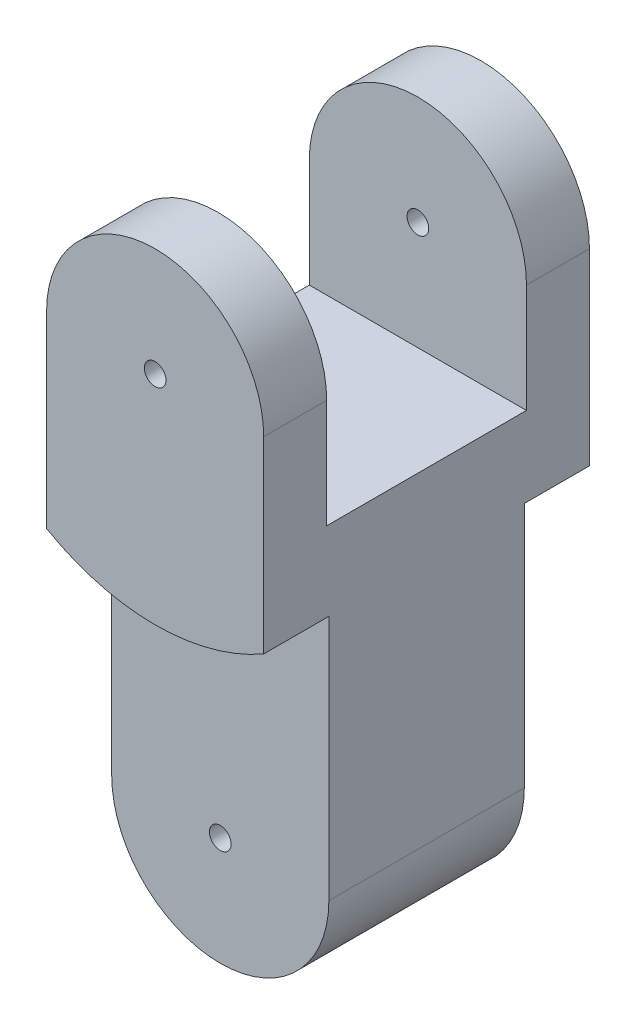
ISO-10303-21;
HEADER;
FILE_DESCRIPTION(('STEP AP214'),'2;1');
FILE_NAME('part.step','',(''),(''),'','','');
FILE_SCHEMA(('AUTOMOTIVE_DESIGN { 1 0 10303 214 1 1 1 1 }'));
ENDSEC;
DATA;
#1=APPLICATION_CONTEXT('core data for automotive mechanical design processes');
#2=APPLICATION_PROTOCOL_DEFINITION('international standard','automotive_design',2000,#1);
#3=PRODUCT_CONTEXT('',#1,'mechanical');
#4=PRODUCT('Part','Part','',(#3));
#5=PRODUCT_RELATED_PRODUCT_CATEGORY('part','',(#4));
#6=PRODUCT_DEFINITION_FORMATION('','',#4);
#7=PRODUCT_DEFINITION_CONTEXT('part definition',#1,'design');
#8=PRODUCT_DEFINITION('design','',#6,#7);
#9=PRODUCT_DEFINITION_SHAPE('','',#8);
#10=(LENGTH_UNIT() NAMED_UNIT(*) SI_UNIT(.MILLI.,.METRE.));
#11=(NAMED_UNIT(*) PLANE_ANGLE_UNIT() SI_UNIT($,.RADIAN.));
#12=(NAMED_UNIT(*) SI_UNIT($,.STERADIAN.) SOLID_ANGLE_UNIT());
#13=UNCERTAINTY_MEASURE_WITH_UNIT(LENGTH_MEASURE(1.E-05),#10,'distance_accuracy_value','');
#14=(GEOMETRIC_REPRESENTATION_CONTEXT(3) GLOBAL_UNCERTAINTY_ASSIGNED_CONTEXT((#13)) GLOBAL_UNIT_ASSIGNED_CONTEXT((#10,
#11,#12)) REPRESENTATION_CONTEXT('',''));
#15=CARTESIAN_POINT('',(0.,0.,0.));
#16=DIRECTION('',(0.,0.,1.));
#17=DIRECTION('',(1.,0.,0.));
#18=AXIS2_PLACEMENT_3D('',#15,#16,#17);
#19=CARTESIAN_POINT('',(0.,200.,90.));
#20=DIRECTION('',(0.,0.,-1.));
#21=DIRECTION('',(-1.,0.,0.));
#22=AXIS2_PLACEMENT_3D('',#19,#20,#21);
#23=CYLINDRICAL_SURFACE('',#22,50.);
#24=CARTESIAN_POINT('',(0.,200.,91.));
#25=DIRECTION('',(0.,0.,-1.));
#26=DIRECTION('',(0.,1.,0.));
#27=AXIS2_PLACEMENT_3D('',#24,#25,#26);
#28=CIRCLE('',#27,50.);
#29=CARTESIAN_POINT('',(-50.,200.,91.));
#30=VERTEX_POINT('',#29);
#31=CARTESIAN_POINT('',(50.,200.,91.));
#32=VERTEX_POINT('',#31);
#33=EDGE_CURVE('E139',#30,#32,#28,.T.);
#34=ORIENTED_EDGE('',*,*,#33,.F.);
#35=DIRECTION('',(0.,0.,-1.));
#36=VECTOR('',#35,1.);
#37=CARTESIAN_POINT('',(-50.,200.,90.));
#38=LINE('',#37,#36);
#39=CARTESIAN_POINT('',(-50.,200.,120.));
#40=VERTEX_POINT('',#39);
#41=EDGE_CURVE('E11',#40,#30,#38,.T.);
#42=ORIENTED_EDGE('',*,*,#41,.F.);
#43=CARTESIAN_POINT('',(0.,200.,120.));
#44=DIRECTION('',(0.,0.,1.));
#45=DIRECTION('',(1.,0.,0.));
#46=AXIS2_PLACEMENT_3D('',#43,#44,#45);
#47=CIRCLE('',#46,50.);
#48=CARTESIAN_POINT('',(50.,200.,120.));
#49=VERTEX_POINT('',#48);
#50=EDGE_CURVE('E190',#49,#40,#47,.T.);
#51=ORIENTED_EDGE('',*,*,#50,.F.);
#52=DIRECTION('',(0.,0.,-1.));
#53=VECTOR('',#52,1.);
#54=CARTESIAN_POINT('',(50.,200.,90.));
#55=LINE('',#54,#53);
#56=EDGE_CURVE('E229',#49,#32,#55,.T.);
#57=ORIENTED_EDGE('',*,*,#56,.T.);
#58=EDGE_LOOP('',(#34,#42,#51,#57));
#59=FACE_BOUND('',#58,.T.);
#60=ADVANCED_FACE('F41',(#59),#23,.T.);
#61=CARTESIAN_POINT('',(0.,200.,-0.999999999999945));
#62=DIRECTION('',(0.,0.,-1.));
#63=DIRECTION('',(0.,1.,0.));
#64=AXIS2_PLACEMENT_3D('',#61,#62,#63);
#65=CIRCLE('',#64,50.);
#66=CARTESIAN_POINT('',(-50.,200.,-0.999999999999936));
#67=VERTEX_POINT('',#66);
#68=CARTESIAN_POINT('',(50.,200.,-0.999999999999936));
#69=VERTEX_POINT('',#68);
#70=EDGE_CURVE('E164',#67,#69,#65,.T.);
#71=ORIENTED_EDGE('',*,*,#70,.T.);
#72=CARTESIAN_POINT('',(50.,200.,-30.));
#73=VERTEX_POINT('',#72);
#74=EDGE_CURVE('E220',#69,#73,#55,.T.);
#75=ORIENTED_EDGE('',*,*,#74,.T.);
#76=CARTESIAN_POINT('',(0.,200.,-30.));
#77=DIRECTION('',(0.,0.,1.));
#78=DIRECTION('',(1.,0.,0.));
#79=AXIS2_PLACEMENT_3D('',#76,#77,#78);
#80=CIRCLE('',#79,50.);
#81=CARTESIAN_POINT('',(-50.,200.,-30.));
#82=VERTEX_POINT('',#81);
#83=EDGE_CURVE('E171',#73,#82,#80,.T.);
#84=ORIENTED_EDGE('',*,*,#83,.T.);
#85=EDGE_CURVE('E50',#67,#82,#38,.T.);
#86=ORIENTED_EDGE('',*,*,#85,.F.);
#87=EDGE_LOOP('',(#71,#75,#84,#86));
#88=FACE_BOUND('',#87,.T.);
#89=ADVANCED_FACE('F270',(#88),#23,.T.);
#90=CARTESIAN_POINT('',(-50.,0.,90.));
#91=DIRECTION('',(1.,0.,0.));
#92=DIRECTION('',(0.,0.,-1.));
#93=AXIS2_PLACEMENT_3D('',#90,#91,#92);
#94=PLANE('',#93);
#95=DIRECTION('',(0.,-1.,0.));
#96=VECTOR('',#95,1.);
#97=CARTESIAN_POINT('',(-50.,0.,91.));
#98=LINE('',#97,#96);
#99=CARTESIAN_POINT('',(-50.,150.,91.));
#100=VERTEX_POINT('',#99);
#101=EDGE_CURVE('E159',#30,#100,#98,.T.);
#102=ORIENTED_EDGE('',*,*,#101,.T.);
#103=DIRECTION('',(0.,0.,1.));
#104=VECTOR('',#103,1.);
#105=CARTESIAN_POINT('',(-50.,150.,0.));
#106=LINE('',#105,#104);
#107=CARTESIAN_POINT('',(-50.,150.,-0.99999999999993));
#108=VERTEX_POINT('',#107);
#109=EDGE_CURVE('E143',#108,#100,#106,.T.);
#110=ORIENTED_EDGE('',*,*,#109,.F.);
#111=DIRECTION('',(0.,-1.,0.));
#112=VECTOR('',#111,1.);
#113=CARTESIAN_POINT('',(-50.,0.,-0.999999999999912));
#114=LINE('',#113,#112);
#115=EDGE_CURVE('E161',#67,#108,#114,.T.);
#116=ORIENTED_EDGE('',*,*,#115,.F.);
#117=ORIENTED_EDGE('',*,*,#85,.T.);
#118=DIRECTION('',(0.,-1.,0.));
#119=VECTOR('',#118,1.);
#120=CARTESIAN_POINT('',(-50.,0.,-30.));
#121=LINE('',#120,#119);
#122=CARTESIAN_POINT('',(-50.,113.397459621556,-30.));
#123=VERTEX_POINT('',#122);
#124=EDGE_CURVE('E179',#82,#123,#121,.T.);
#125=ORIENTED_EDGE('',*,*,#124,.T.);
#126=DIRECTION('',(0.,0.,1.));
#127=VECTOR('',#126,1.);
#128=CARTESIAN_POINT('',(-50.,113.397459621556,-30.));
#129=LINE('',#128,#127);
#130=CARTESIAN_POINT('',(-50.,113.397459621556,0.));
#131=VERTEX_POINT('',#130);
#132=EDGE_CURVE('E182',#123,#131,#129,.T.);
#133=ORIENTED_EDGE('',*,*,#132,.T.);
#134=DIRECTION('',(0.,-1.,0.));
#135=VECTOR('',#134,1.);
#136=CARTESIAN_POINT('',(-50.,0.,0.));
#137=LINE('',#136,#135);
#138=CARTESIAN_POINT('',(-50.,0.,0.));
#139=VERTEX_POINT('',#138);
#140=EDGE_CURVE('E208',#131,#139,#137,.T.);
#141=ORIENTED_EDGE('',*,*,#140,.T.);
#142=DIRECTION('',(0.,0.,-1.));
#143=VECTOR('',#142,1.);
#144=CARTESIAN_POINT('',(-50.,0.,90.));
#145=LINE('',#144,#143);
#146=CARTESIAN_POINT('',(-50.,0.,90.));
#147=VERTEX_POINT('',#146);
#148=EDGE_CURVE('E234',#147,#139,#145,.T.);
#149=ORIENTED_EDGE('',*,*,#148,.F.);
#150=DIRECTION('',(0.,-1.,0.));
#151=VECTOR('',#150,1.);
#152=CARTESIAN_POINT('',(-50.,0.,90.));
#153=LINE('',#152,#151);
#154=CARTESIAN_POINT('',(-50.,113.397459621556,90.));
#155=VERTEX_POINT('',#154);
#156=EDGE_CURVE('E209',#155,#147,#153,.T.);
#157=ORIENTED_EDGE('',*,*,#156,.F.);
#158=DIRECTION('',(0.,0.,-1.));
#159=VECTOR('',#158,1.);
#160=CARTESIAN_POINT('',(-50.,113.397459621556,120.));
#161=LINE('',#160,#159);
#162=CARTESIAN_POINT('',(-50.,113.397459621556,120.));
#163=VERTEX_POINT('',#162);
#164=EDGE_CURVE('E205',#163,#155,#161,.T.);
#165=ORIENTED_EDGE('',*,*,#164,.F.);
#166=DIRECTION('',(0.,-1.,0.));
#167=VECTOR('',#166,1.);
#168=CARTESIAN_POINT('',(-50.,0.,120.));
#169=LINE('',#168,#167);
#170=EDGE_CURVE('E193',#40,#163,#169,.T.);
#171=ORIENTED_EDGE('',*,*,#170,.F.);
#172=ORIENTED_EDGE('',*,*,#41,.T.);
#173=EDGE_LOOP('',(#102,#110,#116,#117,#125,#133,#141,#149,#157,#165,#171,#172));
#174=FACE_BOUND('',#173,.T.);
#175=ADVANCED_FACE('F268',(#174),#94,.F.);
#176=CARTESIAN_POINT('',(50.,0.,90.));
#177=DIRECTION('',(1.,0.,0.));
#178=DIRECTION('',(0.,0.,-1.));
#179=AXIS2_PLACEMENT_3D('',#176,#177,#178);
#180=PLANE('',#179);
#181=DIRECTION('',(0.,0.,1.));
#182=VECTOR('',#181,1.);
#183=CARTESIAN_POINT('',(50.,150.,0.));
#184=LINE('',#183,#182);
#185=CARTESIAN_POINT('',(50.,150.,-0.999999999999935));
#186=VERTEX_POINT('',#185);
#187=CARTESIAN_POINT('',(50.,150.,91.));
#188=VERTEX_POINT('',#187);
#189=EDGE_CURVE('E58',#186,#188,#184,.T.);
#190=ORIENTED_EDGE('',*,*,#189,.T.);
#191=DIRECTION('',(0.,-1.,0.));
#192=VECTOR('',#191,1.);
#193=CARTESIAN_POINT('',(50.,0.,91.));
#194=LINE('',#193,#192);
#195=EDGE_CURVE('E134',#32,#188,#194,.T.);
#196=ORIENTED_EDGE('',*,*,#195,.F.);
#197=ORIENTED_EDGE('',*,*,#56,.F.);
#198=DIRECTION('',(0.,1.,0.));
#199=VECTOR('',#198,1.);
#200=CARTESIAN_POINT('',(50.,0.,120.));
#201=LINE('',#200,#199);
#202=CARTESIAN_POINT('',(50.,113.397459621556,120.));
#203=VERTEX_POINT('',#202);
#204=EDGE_CURVE('E197',#203,#49,#201,.T.);
#205=ORIENTED_EDGE('',*,*,#204,.F.);
#206=DIRECTION('',(0.,0.,-1.));
#207=VECTOR('',#206,1.);
#208=CARTESIAN_POINT('',(50.,113.397459621556,120.));
#209=LINE('',#208,#207);
#210=CARTESIAN_POINT('',(50.,113.397459621556,90.));
#211=VERTEX_POINT('',#210);
#212=EDGE_CURVE('E200',#203,#211,#209,.T.);
#213=ORIENTED_EDGE('',*,*,#212,.T.);
#214=DIRECTION('',(0.,-1.,0.));
#215=VECTOR('',#214,1.);
#216=CARTESIAN_POINT('',(50.,0.,90.));
#217=LINE('',#216,#215);
#218=CARTESIAN_POINT('',(50.,0.,90.));
#219=VERTEX_POINT('',#218);
#220=EDGE_CURVE('E215',#211,#219,#217,.T.);
#221=ORIENTED_EDGE('',*,*,#220,.T.);
#222=DIRECTION('',(0.,0.,-1.));
#223=VECTOR('',#222,1.);
#224=CARTESIAN_POINT('',(50.,0.,90.));
#225=LINE('',#224,#223);
#226=CARTESIAN_POINT('',(50.,0.,0.));
#227=VERTEX_POINT('',#226);
#228=EDGE_CURVE('E231',#219,#227,#225,.T.);
#229=ORIENTED_EDGE('',*,*,#228,.T.);
#230=DIRECTION('',(0.,-1.,0.));
#231=VECTOR('',#230,1.);
#232=CARTESIAN_POINT('',(50.,0.,0.));
#233=LINE('',#232,#231);
#234=CARTESIAN_POINT('',(50.,113.397459621556,0.));
#235=VERTEX_POINT('',#234);
#236=EDGE_CURVE('E225',#235,#227,#233,.T.);
#237=ORIENTED_EDGE('',*,*,#236,.F.);
#238=DIRECTION('',(0.,0.,1.));
#239=VECTOR('',#238,1.);
#240=CARTESIAN_POINT('',(50.,113.397459621556,-30.));
#241=LINE('',#240,#239);
#242=CARTESIAN_POINT('',(50.,113.397459621556,-30.));
#243=VERTEX_POINT('',#242);
#244=EDGE_CURVE('E66',#243,#235,#241,.T.);
#245=ORIENTED_EDGE('',*,*,#244,.F.);
#246=DIRECTION('',(0.,1.,0.));
#247=VECTOR('',#246,1.);
#248=CARTESIAN_POINT('',(50.,0.,-30.));
#249=LINE('',#248,#247);
#250=EDGE_CURVE('E174',#243,#73,#249,.T.);
#251=ORIENTED_EDGE('',*,*,#250,.T.);
#252=ORIENTED_EDGE('',*,*,#74,.F.);
#253=DIRECTION('',(0.,-1.,0.));
#254=VECTOR('',#253,1.);
#255=CARTESIAN_POINT('',(50.,0.,-0.999999999999912));
#256=LINE('',#255,#254);
#257=EDGE_CURVE('E142',#69,#186,#256,.T.);
#258=ORIENTED_EDGE('',*,*,#257,.T.);
#259=EDGE_LOOP('',(#190,#196,#197,#205,#213,#221,#229,#237,#245,#251,#252,#258));
#260=FACE_BOUND('',#259,.T.);
#261=ADVANCED_FACE('F152',(#260),#180,.T.);
#262=CARTESIAN_POINT('',(0.,200.,90.));
#263=DIRECTION('',(0.,0.,-1.));
#264=DIRECTION('',(-1.,0.,0.));
#265=AXIS2_PLACEMENT_3D('',#262,#263,#264);
#266=CYLINDRICAL_SURFACE('',#265,5.);
#267=CARTESIAN_POINT('',(0.,200.,120.));
#268=DIRECTION('',(0.,0.,1.));
#269=DIRECTION('',(1.,0.,0.));
#270=AXIS2_PLACEMENT_3D('',#267,#268,#269);
#271=CIRCLE('',#270,5.);
#272=CARTESIAN_POINT('',(-5.,200.,120.));
#273=VERTEX_POINT('',#272);
#274=EDGE_CURVE('E187',#273,#273,#271,.F.);
#275=CARTESIAN_POINT('',(0.,200.,91.));
#276=DIRECTION('',(0.,0.,-1.));
#277=DIRECTION('',(0.,1.,0.));
#278=AXIS2_PLACEMENT_3D('',#275,#276,#277);
#279=CIRCLE('',#278,5.);
#280=CARTESIAN_POINT('',(-5.,200.,91.));
#281=VERTEX_POINT('',#280);
#282=EDGE_CURVE('E45',#281,#281,#279,.T.);
#283=CARTESIAN_POINT('',(-5.,200.,120.));
#284=CARTESIAN_POINT('',(-5.,200.,119.697916666667));
#285=CARTESIAN_POINT('',(-5.,200.,119.395833333333));
#286=CARTESIAN_POINT('',(-5.,200.,118.791666666667));
#287=CARTESIAN_POINT('',(-5.,200.,118.489583333333));
#288=CARTESIAN_POINT('',(-5.,200.,117.885416666667));
#289=CARTESIAN_POINT('',(-5.,200.,117.583333333333));
#290=CARTESIAN_POINT('',(-5.,200.,116.979166666667));
#291=CARTESIAN_POINT('',(-5.,200.,116.677083333333));
#292=CARTESIAN_POINT('',(-5.,200.,116.072916666667));
#293=CARTESIAN_POINT('',(-5.,200.,115.770833333333));
#294=CARTESIAN_POINT('',(-5.,200.,115.166666666667));
#295=CARTESIAN_POINT('',(-5.,200.,114.864583333333));
#296=CARTESIAN_POINT('',(-5.,200.,114.260416666667));
#297=CARTESIAN_POINT('',(-5.,200.,113.958333333333));
#298=CARTESIAN_POINT('',(-5.,200.,113.354166666667));
#299=CARTESIAN_POINT('',(-5.,200.,113.052083333333));
#300=CARTESIAN_POINT('',(-5.,200.,112.447916666667));
#301=CARTESIAN_POINT('',(-5.,200.,112.145833333333));
#302=CARTESIAN_POINT('',(-5.,200.,111.541666666667));
#303=CARTESIAN_POINT('',(-5.,200.,111.239583333333));
#304=CARTESIAN_POINT('',(-5.,200.,110.635416666667));
#305=CARTESIAN_POINT('',(-5.,200.,110.333333333333));
#306=CARTESIAN_POINT('',(-5.,200.,109.729166666667));
#307=CARTESIAN_POINT('',(-5.,200.,109.427083333333));
#308=CARTESIAN_POINT('',(-5.,200.,108.822916666667));
#309=CARTESIAN_POINT('',(-5.,200.,108.520833333333));
#310=CARTESIAN_POINT('',(-5.,200.,107.916666666667));
#311=CARTESIAN_POINT('',(-5.,200.,107.614583333333));
#312=CARTESIAN_POINT('',(-5.,200.,107.010416666667));
#313=CARTESIAN_POINT('',(-5.,200.,106.708333333333));
#314=CARTESIAN_POINT('',(-5.,200.,106.104166666667));
#315=CARTESIAN_POINT('',(-5.,200.,105.802083333333));
#316=CARTESIAN_POINT('',(-5.,200.,105.197916666667));
#317=CARTESIAN_POINT('',(-5.,200.,104.895833333333));
#318=CARTESIAN_POINT('',(-5.,200.,104.291666666667));
#319=CARTESIAN_POINT('',(-5.,200.,103.989583333333));
#320=CARTESIAN_POINT('',(-5.,200.,103.385416666667));
#321=CARTESIAN_POINT('',(-5.,200.,103.083333333333));
#322=CARTESIAN_POINT('',(-5.,200.,102.479166666667));
#323=CARTESIAN_POINT('',(-5.,200.,102.177083333333));
#324=CARTESIAN_POINT('',(-5.,200.,101.572916666667));
#325=CARTESIAN_POINT('',(-5.,200.,101.270833333333));
#326=CARTESIAN_POINT('',(-5.,200.,100.666666666667));
#327=CARTESIAN_POINT('',(-5.,200.,100.364583333333));
#328=CARTESIAN_POINT('',(-5.,200.,99.7604166666667));
#329=CARTESIAN_POINT('',(-5.,200.,99.4583333333333));
#330=CARTESIAN_POINT('',(-5.,200.,98.8541666666667));
#331=CARTESIAN_POINT('',(-5.,200.,98.5520833333333));
#332=CARTESIAN_POINT('',(-5.,200.,97.9479166666667));
#333=CARTESIAN_POINT('',(-5.,200.,97.6458333333333));
#334=CARTESIAN_POINT('',(-5.,200.,97.0416666666667));
#335=CARTESIAN_POINT('',(-5.,200.,96.7395833333333));
#336=CARTESIAN_POINT('',(-5.,200.,96.1354166666667));
#337=CARTESIAN_POINT('',(-5.,200.,95.8333333333333));
#338=CARTESIAN_POINT('',(-5.,200.,95.2291666666667));
#339=CARTESIAN_POINT('',(-5.,200.,94.9270833333333));
#340=CARTESIAN_POINT('',(-5.,200.,94.3229166666667));
#341=CARTESIAN_POINT('',(-5.,200.,94.0208333333333));
#342=CARTESIAN_POINT('',(-5.,200.,93.4166666666667));
#343=CARTESIAN_POINT('',(-5.,200.,93.1145833333333));
#344=CARTESIAN_POINT('',(-5.,200.,92.5104166666667));
#345=CARTESIAN_POINT('',(-5.,200.,92.2083333333333));
#346=CARTESIAN_POINT('',(-5.,200.,91.6041666666667));
#347=CARTESIAN_POINT('',(-5.,200.,91.3020833333333));
#348=CARTESIAN_POINT('',(-5.,200.,91.));
#349=B_SPLINE_CURVE_WITH_KNOTS('',3,(#283,#284,#285,#286,#287,#288,#289,#290,#291,#292,#293,
#294,#295,#296,#297,#298,#299,#300,#301,#302,#303,#304,#305,#306,#307,#308,#309,#310,#311,#312,
#313,#314,#315,#316,#317,#318,#319,#320,#321,#322,#323,#324,#325,#326,#327,#328,#329,#330,#331,
#332,#333,#334,#335,#336,#337,#338,#339,#340,#341,#342,#343,#344,#345,#346,#347,#348),
.UNSPECIFIED.,.F.,.F.,(4,2,2,2,2,2,2,2,2,2,2,2,2,2,2,2,2,2,2,2,2,2,2,2,2,2,2,2,2,2,2,2,4),(0.,
0.906249999999997,1.81249999999999,2.71874999999999,3.62499999999999,4.53125,5.4375,6.34375,
7.24999999999999,8.15624999999999,9.06249999999999,9.96874999999998,10.875,11.78125,12.6875,
13.59375,14.5,15.40625,16.3125,17.21875,18.125,19.03125,19.9375,20.84375,21.75,22.65625,23.5625,
24.46875,25.375,26.28125,27.1875,28.09375,29.),.UNSPECIFIED.);
#350=EDGE_CURVE('BSEAM246',#273,#281,#349,.T.);
#351=ORIENTED_EDGE('',*,*,#274,.F.);
#352=ORIENTED_EDGE('',*,*,#282,.T.);
#353=ORIENTED_EDGE('',*,*,#350,.T.);
#354=ORIENTED_EDGE('',*,*,#350,.F.);
#355=EDGE_LOOP('',(#351,#353,#352,#354));
#356=FACE_BOUND('',#355,.T.);
#357=ADVANCED_FACE('F246',(#356),#266,.F.);
#358=CARTESIAN_POINT('',(0.,0.,90.));
#359=DIRECTION('',(0.,0.,-1.));
#360=DIRECTION('',(-1.,0.,0.));
#361=AXIS2_PLACEMENT_3D('',#358,#359,#360);
#362=CYLINDRICAL_SURFACE('',#361,50.);
#363=CARTESIAN_POINT('',(0.,0.,0.));
#364=DIRECTION('',(0.,0.,1.));
#365=DIRECTION('',(1.,0.,0.));
#366=AXIS2_PLACEMENT_3D('',#363,#364,#365);
#367=CIRCLE('',#366,50.);
#368=EDGE_CURVE('E222',#139,#227,#367,.T.);
#369=ORIENTED_EDGE('',*,*,#368,.T.);
#370=ORIENTED_EDGE('',*,*,#228,.F.);
#371=CARTESIAN_POINT('',(0.,0.,90.));
#372=DIRECTION('',(0.,0.,1.));
#373=DIRECTION('',(1.,0.,0.));
#374=AXIS2_PLACEMENT_3D('',#371,#372,#373);
#375=CIRCLE('',#374,50.);
#376=EDGE_CURVE('E211',#147,#219,#375,.T.);
#377=ORIENTED_EDGE('',*,*,#376,.F.);
#378=ORIENTED_EDGE('',*,*,#148,.T.);
#379=EDGE_LOOP('',(#369,#370,#377,#378));
#380=FACE_BOUND('',#379,.T.);
#381=ADVANCED_FACE('F245',(#380),#362,.T.);
#382=CARTESIAN_POINT('',(0.,200.,-0.999999999999945));
#383=DIRECTION('',(0.,0.,-1.));
#384=DIRECTION('',(0.,1.,0.));
#385=AXIS2_PLACEMENT_3D('',#382,#383,#384);
#386=CIRCLE('',#385,5.);
#387=CARTESIAN_POINT('',(-5.,200.,-0.999999999999931));
#388=VERTEX_POINT('',#387);
#389=EDGE_CURVE('E148',#388,#388,#386,.T.);
#390=CARTESIAN_POINT('',(0.,200.,-30.));
#391=DIRECTION('',(0.,0.,1.));
#392=DIRECTION('',(1.,0.,0.));
#393=AXIS2_PLACEMENT_3D('',#390,#391,#392);
#394=CIRCLE('',#393,5.);
#395=CARTESIAN_POINT('',(-5.,200.,-30.));
#396=VERTEX_POINT('',#395);
#397=EDGE_CURVE('E168',#396,#396,#394,.F.);
#398=CARTESIAN_POINT('',(-5.,200.,-0.999999999999931));
#399=CARTESIAN_POINT('',(-5.,200.,-1.30208333333326));
#400=CARTESIAN_POINT('',(-5.,200.,-1.6041666666666));
#401=CARTESIAN_POINT('',(-5.,200.,-2.20833333333327));
#402=CARTESIAN_POINT('',(-5.,200.,-2.5104166666666));
#403=CARTESIAN_POINT('',(-5.,200.,-3.11458333333327));
#404=CARTESIAN_POINT('',(-5.,200.,-3.4166666666666));
#405=CARTESIAN_POINT('',(-5.,200.,-4.02083333333327));
#406=CARTESIAN_POINT('',(-5.,200.,-4.32291666666661));
#407=CARTESIAN_POINT('',(-5.,200.,-4.92708333333328));
#408=CARTESIAN_POINT('',(-5.,200.,-5.22916666666661));
#409=CARTESIAN_POINT('',(-5.,200.,-5.83333333333328));
#410=CARTESIAN_POINT('',(-5.,200.,-6.13541666666661));
#411=CARTESIAN_POINT('',(-5.,200.,-6.73958333333328));
#412=CARTESIAN_POINT('',(-5.,200.,-7.04166666666662));
#413=CARTESIAN_POINT('',(-5.,200.,-7.64583333333329));
#414=CARTESIAN_POINT('',(-5.,200.,-7.94791666666662));
#415=CARTESIAN_POINT('',(-5.,200.,-8.55208333333328));
#416=CARTESIAN_POINT('',(-5.,200.,-8.85416666666662));
#417=CARTESIAN_POINT('',(-5.,200.,-9.45833333333329));
#418=CARTESIAN_POINT('',(-5.,200.,-9.76041666666662));
#419=CARTESIAN_POINT('',(-5.,200.,-10.3645833333333));
#420=CARTESIAN_POINT('',(-5.,200.,-10.6666666666666));
#421=CARTESIAN_POINT('',(-5.,200.,-11.2708333333333));
#422=CARTESIAN_POINT('',(-5.,200.,-11.5729166666666));
#423=CARTESIAN_POINT('',(-5.,200.,-12.1770833333333));
#424=CARTESIAN_POINT('',(-5.,200.,-12.4791666666666));
#425=CARTESIAN_POINT('',(-5.,200.,-13.0833333333333));
#426=CARTESIAN_POINT('',(-5.,200.,-13.3854166666666));
#427=CARTESIAN_POINT('',(-5.,200.,-13.9895833333333));
#428=CARTESIAN_POINT('',(-5.,200.,-14.2916666666666));
#429=CARTESIAN_POINT('',(-5.,200.,-14.8958333333333));
#430=CARTESIAN_POINT('',(-5.,200.,-15.1979166666666));
#431=CARTESIAN_POINT('',(-5.,200.,-15.8020833333333));
#432=CARTESIAN_POINT('',(-5.,200.,-16.1041666666666));
#433=CARTESIAN_POINT('',(-5.,200.,-16.7083333333333));
#434=CARTESIAN_POINT('',(-5.,200.,-17.0104166666666));
#435=CARTESIAN_POINT('',(-5.,200.,-17.6145833333333));
#436=CARTESIAN_POINT('',(-5.,200.,-17.9166666666666));
#437=CARTESIAN_POINT('',(-5.,200.,-18.5208333333333));
#438=CARTESIAN_POINT('',(-5.,200.,-18.8229166666667));
#439=CARTESIAN_POINT('',(-5.,200.,-19.4270833333333));
#440=CARTESIAN_POINT('',(-5.,200.,-19.7291666666667));
#441=CARTESIAN_POINT('',(-5.,200.,-20.3333333333333));
#442=CARTESIAN_POINT('',(-5.,200.,-20.6354166666667));
#443=CARTESIAN_POINT('',(-5.,200.,-21.2395833333333));
#444=CARTESIAN_POINT('',(-5.,200.,-21.5416666666667));
#445=CARTESIAN_POINT('',(-5.,200.,-22.1458333333333));
#446=CARTESIAN_POINT('',(-5.,200.,-22.4479166666667));
#447=CARTESIAN_POINT('',(-5.,200.,-23.0520833333333));
#448=CARTESIAN_POINT('',(-5.,200.,-23.3541666666667));
#449=CARTESIAN_POINT('',(-5.,200.,-23.9583333333333));
#450=CARTESIAN_POINT('',(-5.,200.,-24.2604166666667));
#451=CARTESIAN_POINT('',(-5.,200.,-24.8645833333333));
#452=CARTESIAN_POINT('',(-5.,200.,-25.1666666666667));
#453=CARTESIAN_POINT('',(-5.,200.,-25.7708333333333));
#454=CARTESIAN_POINT('',(-5.,200.,-26.0729166666667));
#455=CARTESIAN_POINT('',(-5.,200.,-26.6770833333333));
#456=CARTESIAN_POINT('',(-5.,200.,-26.9791666666667));
#457=CARTESIAN_POINT('',(-5.,200.,-27.5833333333333));
#458=CARTESIAN_POINT('',(-5.,200.,-27.8854166666667));
#459=CARTESIAN_POINT('',(-5.,200.,-28.4895833333333));
#460=CARTESIAN_POINT('',(-5.,200.,-28.7916666666667));
#461=CARTESIAN_POINT('',(-5.,200.,-29.3958333333333));
#462=CARTESIAN_POINT('',(-5.,200.,-29.6979166666667));
#463=CARTESIAN_POINT('',(-5.,200.,-30.));
#464=B_SPLINE_CURVE_WITH_KNOTS('',3,(#398,#399,#400,#401,#402,#403,#404,#405,#406,#407,#408,
#409,#410,#411,#412,#413,#414,#415,#416,#417,#418,#419,#420,#421,#422,#423,#424,#425,#426,#427,
#428,#429,#430,#431,#432,#433,#434,#435,#436,#437,#438,#439,#440,#441,#442,#443,#444,#445,#446,
#447,#448,#449,#450,#451,#452,#453,#454,#455,#456,#457,#458,#459,#460,#461,#462,#463),
.UNSPECIFIED.,.F.,.F.,(4,2,2,2,2,2,2,2,2,2,2,2,2,2,2,2,2,2,2,2,2,2,2,2,2,2,2,2,2,2,2,2,4),(0.,
0.906249999999997,1.81250000000001,2.71875000000001,3.62500000000002,4.53125000000001,
5.43750000000001,6.34375000000002,7.25000000000002,8.15625000000002,9.06250000000003,
9.96875000000003,10.875,11.78125,12.6875,13.59375,14.5,15.40625,16.3125,17.21875,
18.1250000000001,19.0312500000001,19.9375000000001,20.84375,21.7500000000001,22.6562500000001,
23.5625000000001,24.4687500000001,25.3750000000001,26.2812500000001,27.1875000000001,
28.0937500000001,29.0000000000001),.UNSPECIFIED.);
#465=EDGE_CURVE('BSEAM43',#388,#396,#464,.T.);
#466=ORIENTED_EDGE('',*,*,#389,.F.);
#467=ORIENTED_EDGE('',*,*,#397,.T.);
#468=ORIENTED_EDGE('',*,*,#465,.T.);
#469=ORIENTED_EDGE('',*,*,#465,.F.);
#470=EDGE_LOOP('',(#466,#468,#467,#469));
#471=FACE_BOUND('',#470,.T.);
#472=ADVANCED_FACE('F43',(#471),#266,.F.);
#473=CARTESIAN_POINT('',(0.,0.,90.));
#474=DIRECTION('',(0.,0.,-1.));
#475=DIRECTION('',(-1.,0.,0.));
#476=AXIS2_PLACEMENT_3D('',#473,#474,#475);
#477=CYLINDRICAL_SURFACE('',#476,5.);
#478=CARTESIAN_POINT('',(0.,0.,90.));
#479=DIRECTION('',(0.,0.,1.));
#480=DIRECTION('',(1.,0.,0.));
#481=AXIS2_PLACEMENT_3D('',#478,#479,#480);
#482=CIRCLE('',#481,5.);
#483=CARTESIAN_POINT('',(-5.,0.,90.));
#484=VERTEX_POINT('',#483);
#485=EDGE_CURVE('E217',#484,#484,#482,.T.);
#486=CARTESIAN_POINT('',(0.,0.,0.));
#487=DIRECTION('',(0.,0.,1.));
#488=DIRECTION('',(1.,0.,0.));
#489=AXIS2_PLACEMENT_3D('',#486,#487,#488);
#490=CIRCLE('',#489,5.);
#491=CARTESIAN_POINT('',(-5.,0.,0.));
#492=VERTEX_POINT('',#491);
#493=EDGE_CURVE('E212',#492,#492,#490,.T.);
#494=CARTESIAN_POINT('',(-5.,0.,90.));
#495=CARTESIAN_POINT('',(-5.,0.,89.0625));
#496=CARTESIAN_POINT('',(-5.,0.,88.125));
#497=CARTESIAN_POINT('',(-5.,0.,86.25));
#498=CARTESIAN_POINT('',(-5.,0.,85.3125));
#499=CARTESIAN_POINT('',(-5.,0.,83.4375));
#500=CARTESIAN_POINT('',(-5.,0.,82.5));
#501=CARTESIAN_POINT('',(-5.,0.,80.625));
#502=CARTESIAN_POINT('',(-5.,0.,79.6875));
#503=CARTESIAN_POINT('',(-5.,0.,77.8125));
#504=CARTESIAN_POINT('',(-5.,0.,76.875));
#505=CARTESIAN_POINT('',(-5.,0.,75.));
#506=CARTESIAN_POINT('',(-5.,0.,74.0625));
#507=CARTESIAN_POINT('',(-5.,0.,72.1875));
#508=CARTESIAN_POINT('',(-5.,0.,71.25));
#509=CARTESIAN_POINT('',(-5.,0.,69.375));
#510=CARTESIAN_POINT('',(-5.,0.,68.4375));
#511=CARTESIAN_POINT('',(-5.,0.,66.5625));
#512=CARTESIAN_POINT('',(-5.,0.,65.625));
#513=CARTESIAN_POINT('',(-5.,0.,63.75));
#514=CARTESIAN_POINT('',(-5.,0.,62.8125));
#515=CARTESIAN_POINT('',(-5.,0.,60.9375));
#516=CARTESIAN_POINT('',(-5.,0.,60.));
#517=CARTESIAN_POINT('',(-5.,0.,58.125));
#518=CARTESIAN_POINT('',(-5.,0.,57.1875));
#519=CARTESIAN_POINT('',(-5.,0.,55.3125));
#520=CARTESIAN_POINT('',(-5.,0.,54.375));
#521=CARTESIAN_POINT('',(-5.,0.,52.5));
#522=CARTESIAN_POINT('',(-5.,0.,51.5625));
#523=CARTESIAN_POINT('',(-5.,0.,49.6875));
#524=CARTESIAN_POINT('',(-5.,0.,48.75));
#525=CARTESIAN_POINT('',(-5.,0.,46.875));
#526=CARTESIAN_POINT('',(-5.,0.,45.9375));
#527=CARTESIAN_POINT('',(-5.,0.,44.0625));
#528=CARTESIAN_POINT('',(-5.,0.,43.125));
#529=CARTESIAN_POINT('',(-5.,0.,41.25));
#530=CARTESIAN_POINT('',(-5.,0.,40.3125));
#531=CARTESIAN_POINT('',(-5.,0.,38.4375));
#532=CARTESIAN_POINT('',(-5.,0.,37.5));
#533=CARTESIAN_POINT('',(-5.,0.,35.625));
#534=CARTESIAN_POINT('',(-5.,0.,34.6875));
#535=CARTESIAN_POINT('',(-5.,0.,32.8125));
#536=CARTESIAN_POINT('',(-5.,0.,31.875));
#537=CARTESIAN_POINT('',(-5.,0.,30.));
#538=CARTESIAN_POINT('',(-5.,0.,29.0625));
#539=CARTESIAN_POINT('',(-5.,0.,27.1875));
#540=CARTESIAN_POINT('',(-5.,0.,26.25));
#541=CARTESIAN_POINT('',(-5.,0.,24.375));
#542=CARTESIAN_POINT('',(-5.,0.,23.4375));
#543=CARTESIAN_POINT('',(-5.,0.,21.5625));
#544=CARTESIAN_POINT('',(-5.,0.,20.625));
#545=CARTESIAN_POINT('',(-5.,0.,18.75));
#546=CARTESIAN_POINT('',(-5.,0.,17.8125));
#547=CARTESIAN_POINT('',(-5.,0.,15.9375));
#548=CARTESIAN_POINT('',(-5.,0.,15.));
#549=CARTESIAN_POINT('',(-5.,0.,13.125));
#550=CARTESIAN_POINT('',(-5.,0.,12.1875));
#551=CARTESIAN_POINT('',(-5.,0.,10.3125));
#552=CARTESIAN_POINT('',(-5.,0.,9.37499999999999));
#553=CARTESIAN_POINT('',(-5.,0.,7.49999999999999));
#554=CARTESIAN_POINT('',(-5.,0.,6.56249999999999));
#555=CARTESIAN_POINT('',(-5.,0.,4.68749999999999));
#556=CARTESIAN_POINT('',(-5.,0.,3.74999999999998));
#557=CARTESIAN_POINT('',(-5.,0.,1.87499999999998));
#558=CARTESIAN_POINT('',(-5.,0.,0.937499999999986));
#559=CARTESIAN_POINT('',(-5.,0.,0.));
#560=B_SPLINE_CURVE_WITH_KNOTS('',3,(#494,#495,#496,#497,#498,#499,#500,#501,#502,#503,#504,
#505,#506,#507,#508,#509,#510,#511,#512,#513,#514,#515,#516,#517,#518,#519,#520,#521,#522,#523,
#524,#525,#526,#527,#528,#529,#530,#531,#532,#533,#534,#535,#536,#537,#538,#539,#540,#541,#542,
#543,#544,#545,#546,#547,#548,#549,#550,#551,#552,#553,#554,#555,#556,#557,#558,#559),
.UNSPECIFIED.,.F.,.F.,(4,2,2,2,2,2,2,2,2,2,2,2,2,2,2,2,2,2,2,2,2,2,2,2,2,2,2,2,2,2,2,2,4),(0.,
2.8125,5.62499999999999,8.43749999999999,11.25,14.0625,16.875,19.6875,22.5,25.3125,28.125,
30.9375,33.75,36.5625,39.375,42.1875,45.,47.8125,50.625,53.4375,56.25,59.0625,61.875,64.6875,
67.5,70.3125,73.125,75.9375,78.75,81.5625,84.375,87.1875,90.),.UNSPECIFIED.);
#561=EDGE_CURVE('BSEAM244',#484,#492,#560,.T.);
#562=ORIENTED_EDGE('',*,*,#485,.T.);
#563=ORIENTED_EDGE('',*,*,#493,.F.);
#564=ORIENTED_EDGE('',*,*,#561,.T.);
#565=ORIENTED_EDGE('',*,*,#561,.F.);
#566=EDGE_LOOP('',(#562,#564,#563,#565));
#567=FACE_BOUND('',#566,.T.);
#568=ADVANCED_FACE('F244',(#567),#477,.F.);
#569=CARTESIAN_POINT('',(0.,0.,90.));
#570=DIRECTION('',(0.,0.,1.));
#571=DIRECTION('',(1.,0.,0.));
#572=AXIS2_PLACEMENT_3D('',#569,#570,#571);
#573=PLANE('',#572);
#574=CARTESIAN_POINT('',(0.,200.,90.));
#575=DIRECTION('',(0.,0.,1.));
#576=DIRECTION('',(1.,0.,0.));
#577=AXIS2_PLACEMENT_3D('',#574,#575,#576);
#578=CIRCLE('',#577,100.);
#579=EDGE_CURVE('E186',#155,#211,#578,.T.);
#580=ORIENTED_EDGE('',*,*,#579,.F.);
#581=ORIENTED_EDGE('',*,*,#156,.T.);
#582=ORIENTED_EDGE('',*,*,#376,.T.);
#583=ORIENTED_EDGE('',*,*,#220,.F.);
#584=EDGE_LOOP('',(#580,#581,#582,#583));
#585=FACE_BOUND('',#584,.T.);
#586=ORIENTED_EDGE('',*,*,#485,.F.);
#587=EDGE_LOOP('',(#586));
#588=FACE_BOUND('',#587,.T.);
#589=ADVANCED_FACE('F284',(#585,#588),#573,.T.);
#590=CARTESIAN_POINT('',(0.,0.,0.));
#591=DIRECTION('',(0.,0.,1.));
#592=DIRECTION('',(1.,0.,0.));
#593=AXIS2_PLACEMENT_3D('',#590,#591,#592);
#594=PLANE('',#593);
#595=ORIENTED_EDGE('',*,*,#140,.F.);
#596=CARTESIAN_POINT('',(0.,200.,0.));
#597=DIRECTION('',(0.,0.,1.));
#598=DIRECTION('',(1.,0.,0.));
#599=AXIS2_PLACEMENT_3D('',#596,#597,#598);
#600=CIRCLE('',#599,100.);
#601=EDGE_CURVE('E167',#131,#235,#600,.T.);
#602=ORIENTED_EDGE('',*,*,#601,.T.);
#603=ORIENTED_EDGE('',*,*,#236,.T.);
#604=ORIENTED_EDGE('',*,*,#368,.F.);
#605=EDGE_LOOP('',(#595,#602,#603,#604));
#606=FACE_BOUND('',#605,.T.);
#607=ORIENTED_EDGE('',*,*,#493,.T.);
#608=EDGE_LOOP('',(#607));
#609=FACE_BOUND('',#608,.T.);
#610=ADVANCED_FACE('F265',(#606,#609),#594,.F.);
#611=CARTESIAN_POINT('',(0.,200.,120.));
#612=DIRECTION('',(0.,0.,-1.));
#613=DIRECTION('',(-1.,0.,0.));
#614=AXIS2_PLACEMENT_3D('',#611,#612,#613);
#615=CYLINDRICAL_SURFACE('',#614,100.);
#616=ORIENTED_EDGE('',*,*,#579,.T.);
#617=ORIENTED_EDGE('',*,*,#212,.F.);
#618=CARTESIAN_POINT('',(0.,200.,120.));
#619=DIRECTION('',(0.,0.,1.));
#620=DIRECTION('',(1.,0.,0.));
#621=AXIS2_PLACEMENT_3D('',#618,#619,#620);
#622=CIRCLE('',#621,100.);
#623=EDGE_CURVE('E195',#163,#203,#622,.T.);
#624=ORIENTED_EDGE('',*,*,#623,.F.);
#625=ORIENTED_EDGE('',*,*,#164,.T.);
#626=EDGE_LOOP('',(#616,#617,#624,#625));
#627=FACE_BOUND('',#626,.T.);
#628=ADVANCED_FACE('F281',(#627),#615,.T.);
#629=CARTESIAN_POINT('',(0.,0.,120.));
#630=DIRECTION('',(0.,0.,1.));
#631=DIRECTION('',(1.,0.,0.));
#632=AXIS2_PLACEMENT_3D('',#629,#630,#631);
#633=PLANE('',#632);
#634=ORIENTED_EDGE('',*,*,#274,.T.);
#635=EDGE_LOOP('',(#634));
#636=FACE_BOUND('',#635,.T.);
#637=ORIENTED_EDGE('',*,*,#50,.T.);
#638=ORIENTED_EDGE('',*,*,#170,.T.);
#639=ORIENTED_EDGE('',*,*,#623,.T.);
#640=ORIENTED_EDGE('',*,*,#204,.T.);
#641=EDGE_LOOP('',(#637,#638,#639,#640));
#642=FACE_BOUND('',#641,.T.);
#643=ADVANCED_FACE('F277',(#636,#642),#633,.T.);
#644=CARTESIAN_POINT('',(0.,200.,-30.));
#645=DIRECTION('',(0.,0.,1.));
#646=DIRECTION('',(1.,0.,0.));
#647=AXIS2_PLACEMENT_3D('',#644,#645,#646);
#648=CYLINDRICAL_SURFACE('',#647,100.);
#649=ORIENTED_EDGE('',*,*,#601,.F.);
#650=ORIENTED_EDGE('',*,*,#132,.F.);
#651=CARTESIAN_POINT('',(0.,200.,-30.));
#652=DIRECTION('',(0.,0.,1.));
#653=DIRECTION('',(1.,0.,0.));
#654=AXIS2_PLACEMENT_3D('',#651,#652,#653);
#655=CIRCLE('',#654,100.);
#656=EDGE_CURVE('E177',#123,#243,#655,.T.);
#657=ORIENTED_EDGE('',*,*,#656,.T.);
#658=ORIENTED_EDGE('',*,*,#244,.T.);
#659=EDGE_LOOP('',(#649,#650,#657,#658));
#660=FACE_BOUND('',#659,.T.);
#661=ADVANCED_FACE('F252',(#660),#648,.T.);
#662=CARTESIAN_POINT('',(0.,0.,-30.));
#663=DIRECTION('',(0.,0.,-1.));
#664=DIRECTION('',(1.,0.,0.));
#665=AXIS2_PLACEMENT_3D('',#662,#663,#664);
#666=PLANE('',#665);
#667=ORIENTED_EDGE('',*,*,#397,.F.);
#668=EDGE_LOOP('',(#667));
#669=FACE_BOUND('',#668,.T.);
#670=ORIENTED_EDGE('',*,*,#83,.F.);
#671=ORIENTED_EDGE('',*,*,#250,.F.);
#672=ORIENTED_EDGE('',*,*,#656,.F.);
#673=ORIENTED_EDGE('',*,*,#124,.F.);
#674=EDGE_LOOP('',(#670,#671,#672,#673));
#675=FACE_BOUND('',#674,.T.);
#676=ADVANCED_FACE('F249',(#669,#675),#666,.T.);
#677=CARTESIAN_POINT('',(50.,0.,91.));
#678=DIRECTION('',(0.,0.,-1.));
#679=DIRECTION('',(0.,1.,0.));
#680=AXIS2_PLACEMENT_3D('',#677,#678,#679);
#681=PLANE('',#680);
#682=ORIENTED_EDGE('',*,*,#282,.F.);
#683=EDGE_LOOP('',(#682));
#684=FACE_BOUND('',#683,.T.);
#685=ORIENTED_EDGE('',*,*,#33,.T.);
#686=ORIENTED_EDGE('',*,*,#195,.T.);
#687=DIRECTION('',(-1.,0.,0.));
#688=VECTOR('',#687,1.);
#689=CARTESIAN_POINT('',(50.,150.,91.));
#690=LINE('',#689,#688);
#691=EDGE_CURVE('E137',#188,#100,#690,.T.);
#692=ORIENTED_EDGE('',*,*,#691,.T.);
#693=ORIENTED_EDGE('',*,*,#101,.F.);
#694=EDGE_LOOP('',(#685,#686,#692,#693));
#695=FACE_BOUND('',#694,.T.);
#696=ADVANCED_FACE('F135',(#684,#695),#681,.T.);
#697=CARTESIAN_POINT('',(50.,0.,-0.999999999999912));
#698=DIRECTION('',(0.,0.,-1.));
#699=DIRECTION('',(0.,1.,0.));
#700=AXIS2_PLACEMENT_3D('',#697,#698,#699);
#701=PLANE('',#700);
#702=ORIENTED_EDGE('',*,*,#389,.T.);
#703=EDGE_LOOP('',(#702));
#704=FACE_BOUND('',#703,.T.);
#705=ORIENTED_EDGE('',*,*,#70,.F.);
#706=ORIENTED_EDGE('',*,*,#115,.T.);
#707=DIRECTION('',(-1.,0.,0.));
#708=VECTOR('',#707,1.);
#709=CARTESIAN_POINT('',(50.,150.,-0.99999999999993));
#710=LINE('',#709,#708);
#711=EDGE_CURVE('E149',#186,#108,#710,.T.);
#712=ORIENTED_EDGE('',*,*,#711,.F.);
#713=ORIENTED_EDGE('',*,*,#257,.F.);
#714=EDGE_LOOP('',(#705,#706,#712,#713));
#715=FACE_BOUND('',#714,.T.);
#716=ADVANCED_FACE('F239',(#704,#715),#701,.F.);
#717=CARTESIAN_POINT('',(50.,150.,0.));
#718=DIRECTION('',(0.,-1.,0.));
#719=DIRECTION('',(0.,0.,-1.));
#720=AXIS2_PLACEMENT_3D('',#717,#718,#719);
#721=PLANE('',#720);
#722=ORIENTED_EDGE('',*,*,#109,.T.);
#723=ORIENTED_EDGE('',*,*,#691,.F.);
#724=ORIENTED_EDGE('',*,*,#189,.F.);
#725=ORIENTED_EDGE('',*,*,#711,.T.);
#726=EDGE_LOOP('',(#722,#723,#724,#725));
#727=FACE_BOUND('',#726,.T.);
#728=ADVANCED_FACE('F145',(#727),#721,.F.);
#729=CLOSED_SHELL('',(#60,#89,#175,#261,#357,#381,#472,#568,#589,#610,#628,#643,#661,#676,#696,
#716,#728));
#730=MANIFOLD_SOLID_BREP('B2',#729);
#731=ADVANCED_BREP_SHAPE_REPRESENTATION('',(#18,#730),#14);
#732=SHAPE_DEFINITION_REPRESENTATION(#9,#731);
ENDSEC;
END-ISO-10303-21;
